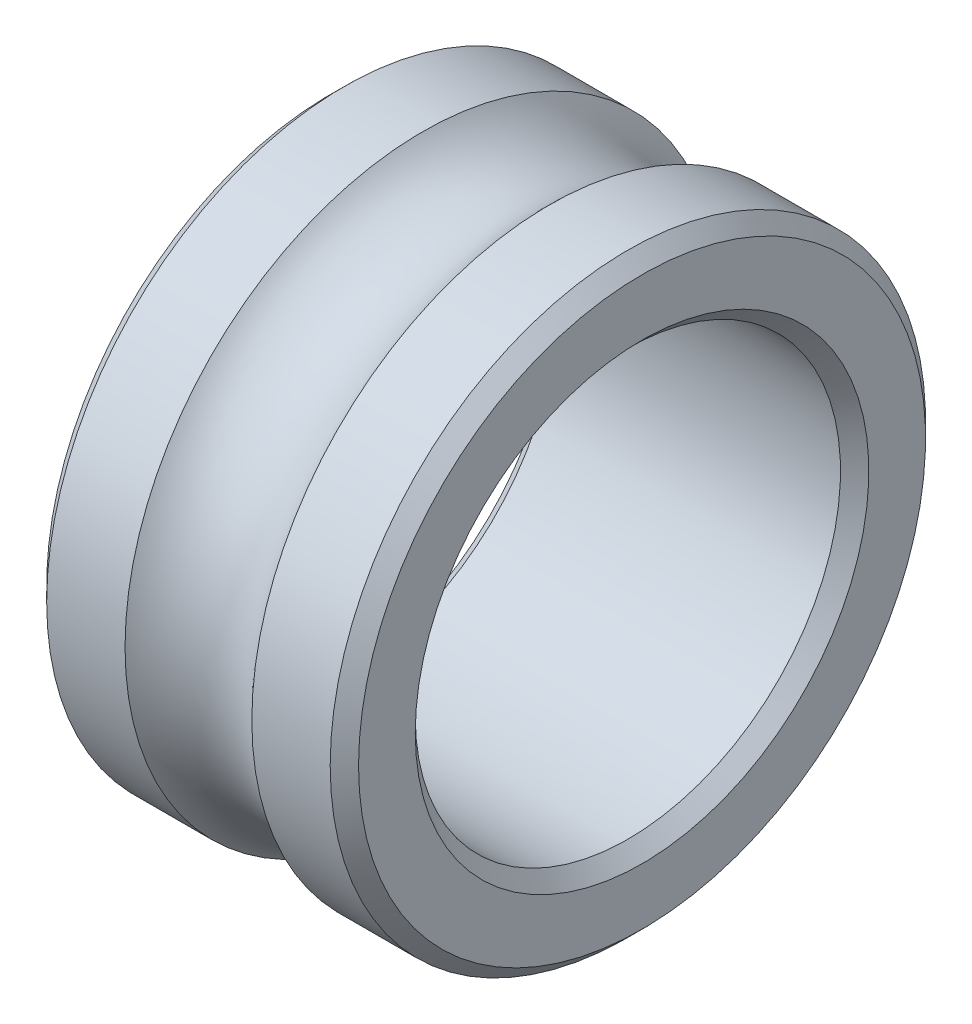
ISO-10303-21;
HEADER;
FILE_DESCRIPTION(('STEP AP214'),'2;1');
FILE_NAME('part.step','',(''),(''),'','','');
FILE_SCHEMA(('AUTOMOTIVE_DESIGN { 1 0 10303 214 1 1 1 1 }'));
ENDSEC;
DATA;
#1=APPLICATION_CONTEXT('core data for automotive mechanical design processes');
#2=APPLICATION_PROTOCOL_DEFINITION('international standard','automotive_design',2000,#1);
#3=PRODUCT_CONTEXT('',#1,'mechanical');
#4=PRODUCT('Part','Part','',(#3));
#5=PRODUCT_RELATED_PRODUCT_CATEGORY('part','',(#4));
#6=PRODUCT_DEFINITION_FORMATION('','',#4);
#7=PRODUCT_DEFINITION_CONTEXT('part definition',#1,'design');
#8=PRODUCT_DEFINITION('design','',#6,#7);
#9=PRODUCT_DEFINITION_SHAPE('','',#8);
#10=(LENGTH_UNIT() NAMED_UNIT(*) SI_UNIT(.MILLI.,.METRE.));
#11=(NAMED_UNIT(*) PLANE_ANGLE_UNIT() SI_UNIT($,.RADIAN.));
#12=(NAMED_UNIT(*) SI_UNIT($,.STERADIAN.) SOLID_ANGLE_UNIT());
#13=UNCERTAINTY_MEASURE_WITH_UNIT(LENGTH_MEASURE(1.E-05),#10,'distance_accuracy_value','');
#14=(GEOMETRIC_REPRESENTATION_CONTEXT(3) GLOBAL_UNCERTAINTY_ASSIGNED_CONTEXT((#13)) GLOBAL_UNIT_ASSIGNED_CONTEXT((#10,
#11,#12)) REPRESENTATION_CONTEXT('',''));
#15=CARTESIAN_POINT('',(0.,0.,0.));
#16=DIRECTION('',(0.,0.,1.));
#17=DIRECTION('',(1.,0.,0.));
#18=AXIS2_PLACEMENT_3D('',#15,#16,#17);
#19=CARTESIAN_POINT('',(-5.5,10.5,0.));
#20=DIRECTION('',(1.,0.,0.));
#21=DIRECTION('',(0.,0.,-1.));
#22=AXIS2_PLACEMENT_3D('',#19,#20,#21);
#23=PLANE('',#22);
#24=CARTESIAN_POINT('',(-5.5,0.,0.));
#25=DIRECTION('',(1.,0.,0.));
#26=DIRECTION('',(0.,0.,-1.));
#27=AXIS2_PLACEMENT_3D('',#24,#25,#26);
#28=CIRCLE('',#27,10.);
#29=CARTESIAN_POINT('',(-5.5,0.,-10.));
#30=VERTEX_POINT('',#29);
#31=EDGE_CURVE('E38',#30,#30,#28,.F.);
#32=ORIENTED_EDGE('',*,*,#31,.T.);
#33=EDGE_LOOP('',(#32));
#34=FACE_BOUND('',#33,.T.);
#35=CARTESIAN_POINT('',(-5.5,0.,0.));
#36=DIRECTION('',(1.,0.,0.));
#37=DIRECTION('',(0.,0.,-1.));
#38=AXIS2_PLACEMENT_3D('',#35,#36,#37);
#39=CIRCLE('',#38,8.);
#40=CARTESIAN_POINT('',(-5.5,0.,-8.));
#41=VERTEX_POINT('',#40);
#42=EDGE_CURVE('E42',#41,#41,#39,.T.);
#43=ORIENTED_EDGE('',*,*,#42,.T.);
#44=EDGE_LOOP('',(#43));
#45=FACE_BOUND('',#44,.T.);
#46=ADVANCED_FACE('F31',(#34,#45),#23,.F.);
#47=CARTESIAN_POINT('',(-28.2911392405063,0.,0.));
#48=DIRECTION('',(-1.,0.,0.));
#49=DIRECTION('',(0.,0.,1.));
#50=AXIS2_PLACEMENT_3D('',#47,#48,#49);
#51=CYLINDRICAL_SURFACE('',#50,7.5);
#52=CARTESIAN_POINT('',(5.,0.,0.));
#53=DIRECTION('',(-1.,0.,0.));
#54=DIRECTION('',(0.,0.,1.));
#55=AXIS2_PLACEMENT_3D('',#52,#53,#54);
#56=CIRCLE('',#55,7.5);
#57=CARTESIAN_POINT('',(5.,0.,7.5));
#58=VERTEX_POINT('',#57);
#59=EDGE_CURVE('E46',#58,#58,#56,.F.);
#60=ORIENTED_EDGE('',*,*,#59,.T.);
#61=EDGE_LOOP('',(#60));
#62=FACE_BOUND('',#61,.T.);
#63=CARTESIAN_POINT('',(-5.,0.,0.));
#64=DIRECTION('',(1.,0.,0.));
#65=DIRECTION('',(0.,0.,-1.));
#66=AXIS2_PLACEMENT_3D('',#63,#64,#65);
#67=CIRCLE('',#66,7.5);
#68=CARTESIAN_POINT('',(-5.,0.,-7.5));
#69=VERTEX_POINT('',#68);
#70=EDGE_CURVE('E51',#69,#69,#67,.F.);
#71=ORIENTED_EDGE('',*,*,#70,.T.);
#72=EDGE_LOOP('',(#71));
#73=FACE_BOUND('',#72,.T.);
#74=ADVANCED_FACE('F86',(#62,#73),#51,.F.);
#75=CARTESIAN_POINT('',(5.5,10.5,0.));
#76=DIRECTION('',(-1.,0.,0.));
#77=DIRECTION('',(0.,0.,1.));
#78=AXIS2_PLACEMENT_3D('',#75,#76,#77);
#79=PLANE('',#78);
#80=CARTESIAN_POINT('',(5.5,0.,0.));
#81=DIRECTION('',(-1.,0.,0.));
#82=DIRECTION('',(0.,0.,1.));
#83=AXIS2_PLACEMENT_3D('',#80,#81,#82);
#84=CIRCLE('',#83,10.);
#85=CARTESIAN_POINT('',(5.5,0.,10.));
#86=VERTEX_POINT('',#85);
#87=EDGE_CURVE('E54',#86,#86,#84,.F.);
#88=ORIENTED_EDGE('',*,*,#87,.T.);
#89=EDGE_LOOP('',(#88));
#90=FACE_BOUND('',#89,.T.);
#91=CARTESIAN_POINT('',(5.5,0.,0.));
#92=DIRECTION('',(-1.,0.,0.));
#93=DIRECTION('',(0.,0.,1.));
#94=AXIS2_PLACEMENT_3D('',#91,#92,#93);
#95=CIRCLE('',#94,8.);
#96=CARTESIAN_POINT('',(5.5,0.,8.));
#97=VERTEX_POINT('',#96);
#98=EDGE_CURVE('E57',#97,#97,#95,.T.);
#99=ORIENTED_EDGE('',*,*,#98,.T.);
#100=EDGE_LOOP('',(#99));
#101=FACE_BOUND('',#100,.T.);
#102=ADVANCED_FACE('F80',(#90,#101),#79,.F.);
#103=CARTESIAN_POINT('',(-28.2911392405063,0.,0.));
#104=DIRECTION('',(-1.,0.,0.));
#105=DIRECTION('',(0.,0.,1.));
#106=AXIS2_PLACEMENT_3D('',#103,#104,#105);
#107=CYLINDRICAL_SURFACE('',#106,10.5);
#108=CARTESIAN_POINT('',(4.99999999999999,0.,0.));
#109=DIRECTION('',(-1.,0.,0.));
#110=DIRECTION('',(0.,0.,1.));
#111=AXIS2_PLACEMENT_3D('',#108,#109,#110);
#112=CIRCLE('',#111,10.5);
#113=CARTESIAN_POINT('',(4.99999999999999,0.,10.5));
#114=VERTEX_POINT('',#113);
#115=EDGE_CURVE('E60',#114,#114,#112,.T.);
#116=ORIENTED_EDGE('',*,*,#115,.T.);
#117=EDGE_LOOP('',(#116));
#118=FACE_BOUND('',#117,.T.);
#119=CARTESIAN_POINT('',(2.23606797749978,0.,0.));
#120=DIRECTION('',(-1.,0.,0.));
#121=DIRECTION('',(0.,0.,1.));
#122=AXIS2_PLACEMENT_3D('',#119,#120,#121);
#123=CIRCLE('',#122,10.5);
#124=CARTESIAN_POINT('',(2.23606797749978,0.,10.5));
#125=VERTEX_POINT('',#124);
#126=EDGE_CURVE('E63',#125,#125,#123,.T.);
#127=ORIENTED_EDGE('',*,*,#126,.F.);
#128=EDGE_LOOP('',(#127));
#129=FACE_BOUND('',#128,.T.);
#130=ADVANCED_FACE('F75',(#118,#129),#107,.T.);
#131=CARTESIAN_POINT('',(0.,0.,0.));
#132=DIRECTION('',(-1.,0.,0.));
#133=DIRECTION('',(0.,0.,1.));
#134=AXIS2_PLACEMENT_3D('',#131,#132,#133);
#135=TOROIDAL_SURFACE('',#134,12.5,3.);
#136=CARTESIAN_POINT('',(-2.2360679774998,0.,0.));
#137=DIRECTION('',(-1.,0.,0.));
#138=DIRECTION('',(0.,0.,1.));
#139=AXIS2_PLACEMENT_3D('',#136,#137,#138);
#140=CIRCLE('',#139,10.5);
#141=CARTESIAN_POINT('',(-2.2360679774998,0.,10.5));
#142=VERTEX_POINT('',#141);
#143=EDGE_CURVE('E66',#142,#142,#140,.T.);
#144=ORIENTED_EDGE('',*,*,#143,.F.);
#145=EDGE_LOOP('',(#144));
#146=FACE_BOUND('',#145,.T.);
#147=ORIENTED_EDGE('',*,*,#126,.T.);
#148=EDGE_LOOP('',(#147));
#149=FACE_BOUND('',#148,.T.);
#150=ADVANCED_FACE('F72',(#146,#149),#135,.F.);
#151=CARTESIAN_POINT('',(-28.2911392405063,0.,0.));
#152=DIRECTION('',(-1.,0.,0.));
#153=DIRECTION('',(0.,0.,1.));
#154=AXIS2_PLACEMENT_3D('',#151,#152,#153);
#155=CYLINDRICAL_SURFACE('',#154,10.5);
#156=CARTESIAN_POINT('',(-5.,0.,0.));
#157=DIRECTION('',(1.,0.,0.));
#158=DIRECTION('',(0.,0.,-1.));
#159=AXIS2_PLACEMENT_3D('',#156,#157,#158);
#160=CIRCLE('',#159,10.5);
#161=CARTESIAN_POINT('',(-5.,0.,-10.5));
#162=VERTEX_POINT('',#161);
#163=EDGE_CURVE('E10',#162,#162,#160,.T.);
#164=ORIENTED_EDGE('',*,*,#163,.T.);
#165=EDGE_LOOP('',(#164));
#166=FACE_BOUND('',#165,.T.);
#167=ORIENTED_EDGE('',*,*,#143,.T.);
#168=EDGE_LOOP('',(#167));
#169=FACE_BOUND('',#168,.T.);
#170=ADVANCED_FACE('F70',(#166,#169),#155,.T.);
#171=CARTESIAN_POINT('',(4.99999999999999,0.,0.));
#172=DIRECTION('',(-1.,0.,0.));
#173=DIRECTION('',(0.,0.,1.));
#174=AXIS2_PLACEMENT_3D('',#171,#172,#173);
#175=CONICAL_SURFACE('',#174,10.5,0.785398163397441);
#176=ORIENTED_EDGE('',*,*,#87,.F.);
#177=EDGE_LOOP('',(#176));
#178=FACE_BOUND('',#177,.T.);
#179=ORIENTED_EDGE('',*,*,#115,.F.);
#180=EDGE_LOOP('',(#179));
#181=FACE_BOUND('',#180,.T.);
#182=ADVANCED_FACE('F98',(#178,#181),#175,.T.);
#183=CARTESIAN_POINT('',(5.5,0.,0.));
#184=DIRECTION('',(1.,0.,0.));
#185=DIRECTION('',(0.,0.,-1.));
#186=AXIS2_PLACEMENT_3D('',#183,#184,#185);
#187=CONICAL_SURFACE('',#186,8.,0.785398163397449);
#188=ORIENTED_EDGE('',*,*,#59,.F.);
#189=EDGE_LOOP('',(#188));
#190=FACE_BOUND('',#189,.T.);
#191=ORIENTED_EDGE('',*,*,#98,.F.);
#192=EDGE_LOOP('',(#191));
#193=FACE_BOUND('',#192,.T.);
#194=ADVANCED_FACE('F101',(#190,#193),#187,.F.);
#195=CARTESIAN_POINT('',(-5.5,0.,0.));
#196=DIRECTION('',(1.,0.,0.));
#197=DIRECTION('',(0.,0.,-1.));
#198=AXIS2_PLACEMENT_3D('',#195,#196,#197);
#199=CONICAL_SURFACE('',#198,10.,0.785398163397452);
#200=ORIENTED_EDGE('',*,*,#163,.F.);
#201=EDGE_LOOP('',(#200));
#202=FACE_BOUND('',#201,.T.);
#203=ORIENTED_EDGE('',*,*,#31,.F.);
#204=EDGE_LOOP('',(#203));
#205=FACE_BOUND('',#204,.T.);
#206=ADVANCED_FACE('F104',(#202,#205),#199,.T.);
#207=CARTESIAN_POINT('',(-5.,0.,0.));
#208=DIRECTION('',(-1.,0.,0.));
#209=DIRECTION('',(0.,0.,1.));
#210=AXIS2_PLACEMENT_3D('',#207,#208,#209);
#211=CONICAL_SURFACE('',#210,7.5,0.785398163397446);
#212=ORIENTED_EDGE('',*,*,#42,.F.);
#213=EDGE_LOOP('',(#212));
#214=FACE_BOUND('',#213,.T.);
#215=ORIENTED_EDGE('',*,*,#70,.F.);
#216=EDGE_LOOP('',(#215));
#217=FACE_BOUND('',#216,.T.);
#218=ADVANCED_FACE('F33',(#214,#217),#211,.F.);
#219=CLOSED_SHELL('',(#46,#74,#102,#130,#150,#170,#182,#194,#206,#218));
#220=MANIFOLD_SOLID_BREP('B2',#219);
#221=ADVANCED_BREP_SHAPE_REPRESENTATION('',(#18,#220),#14);
#222=SHAPE_DEFINITION_REPRESENTATION(#9,#221);
ENDSEC;
END-ISO-10303-21;
